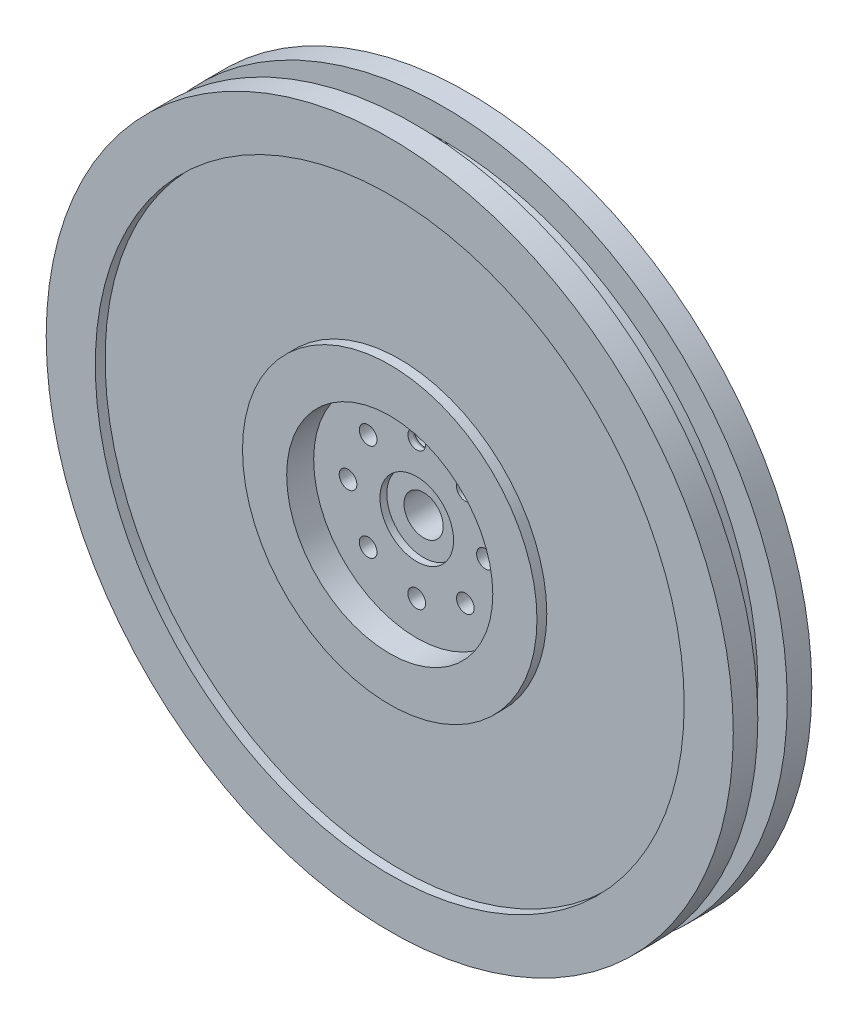
ISO-10303-21;
HEADER;
FILE_DESCRIPTION(('STEP AP214'),'2;1');
FILE_NAME('part.step','',(''),(''),'','','');
FILE_SCHEMA(('AUTOMOTIVE_DESIGN { 1 0 10303 214 1 1 1 1 }'));
ENDSEC;
DATA;
#1=APPLICATION_CONTEXT('core data for automotive mechanical design processes');
#2=APPLICATION_PROTOCOL_DEFINITION('international standard','automotive_design',2000,#1);
#3=PRODUCT_CONTEXT('',#1,'mechanical');
#4=PRODUCT('Part','Part','',(#3));
#5=PRODUCT_RELATED_PRODUCT_CATEGORY('part','',(#4));
#6=PRODUCT_DEFINITION_FORMATION('','',#4);
#7=PRODUCT_DEFINITION_CONTEXT('part definition',#1,'design');
#8=PRODUCT_DEFINITION('design','',#6,#7);
#9=PRODUCT_DEFINITION_SHAPE('','',#8);
#10=(LENGTH_UNIT() NAMED_UNIT(*) SI_UNIT(.MILLI.,.METRE.));
#11=(NAMED_UNIT(*) PLANE_ANGLE_UNIT() SI_UNIT($,.RADIAN.));
#12=(NAMED_UNIT(*) SI_UNIT($,.STERADIAN.) SOLID_ANGLE_UNIT());
#13=UNCERTAINTY_MEASURE_WITH_UNIT(LENGTH_MEASURE(1.E-05),#10,'distance_accuracy_value','');
#14=(GEOMETRIC_REPRESENTATION_CONTEXT(3) GLOBAL_UNCERTAINTY_ASSIGNED_CONTEXT((#13)) GLOBAL_UNIT_ASSIGNED_CONTEXT((#10,
#11,#12)) REPRESENTATION_CONTEXT('',''));
#15=CARTESIAN_POINT('',(0.,0.,0.));
#16=DIRECTION('',(0.,0.,1.));
#17=DIRECTION('',(1.,0.,0.));
#18=AXIS2_PLACEMENT_3D('',#15,#16,#17);
#19=CARTESIAN_POINT('',(0.,0.,0.));
#20=DIRECTION('',(0.,0.,1.));
#21=DIRECTION('',(1.,0.,0.));
#22=AXIS2_PLACEMENT_3D('',#19,#20,#21);
#23=PLANE('',#22);
#24=CARTESIAN_POINT('',(0.,0.,0.));
#25=DIRECTION('',(0.,0.,1.));
#26=DIRECTION('',(1.,0.,0.));
#27=AXIS2_PLACEMENT_3D('',#24,#25,#26);
#28=CIRCLE('',#27,10.5);
#29=CARTESIAN_POINT('',(10.5,0.,0.));
#30=VERTEX_POINT('',#29);
#31=EDGE_CURVE('E211',#30,#30,#28,.T.);
#32=ORIENTED_EDGE('',*,*,#31,.F.);
#33=EDGE_LOOP('',(#32));
#34=FACE_BOUND('',#33,.T.);
#35=CARTESIAN_POINT('',(0.,0.,0.));
#36=DIRECTION('',(0.,0.,1.));
#37=DIRECTION('',(1.,0.,0.));
#38=AXIS2_PLACEMENT_3D('',#35,#36,#37);
#39=CIRCLE('',#38,15.);
#40=CARTESIAN_POINT('',(15.,0.,0.));
#41=VERTEX_POINT('',#40);
#42=EDGE_CURVE('E307',#41,#41,#39,.T.);
#43=ORIENTED_EDGE('',*,*,#42,.T.);
#44=EDGE_LOOP('',(#43));
#45=FACE_BOUND('',#44,.T.);
#46=ADVANCED_FACE('F32',(#34,#45),#23,.T.);
#47=CARTESIAN_POINT('',(0.,7.,-8.));
#48=DIRECTION('',(0.,0.,1.));
#49=DIRECTION('',(1.,0.,0.));
#50=AXIS2_PLACEMENT_3D('',#47,#48,#49);
#51=CYLINDRICAL_SURFACE('',#50,0.9);
#52=CARTESIAN_POINT('',(0.,7.,-5.72360679774999));
#53=DIRECTION('',(0.,0.,1.));
#54=DIRECTION('',(1.,0.,0.));
#55=AXIS2_PLACEMENT_3D('',#52,#53,#54);
#56=CIRCLE('',#55,0.9);
#57=CARTESIAN_POINT('',(0.9,7.,-5.72360679774999));
#58=VERTEX_POINT('',#57);
#59=EDGE_CURVE('E41',#58,#58,#56,.T.);
#60=ORIENTED_EDGE('',*,*,#59,.T.);
#61=EDGE_LOOP('',(#60));
#62=FACE_BOUND('',#61,.T.);
#63=CARTESIAN_POINT('',(0.,7.,-7.));
#64=DIRECTION('',(0.,0.,-1.));
#65=DIRECTION('',(-1.,0.,0.));
#66=AXIS2_PLACEMENT_3D('',#63,#64,#65);
#67=CIRCLE('',#66,0.9);
#68=CARTESIAN_POINT('',(-0.9,7.,-7.));
#69=VERTEX_POINT('',#68);
#70=EDGE_CURVE('E272',#69,#69,#67,.F.);
#71=ORIENTED_EDGE('',*,*,#70,.F.);
#72=EDGE_LOOP('',(#71));
#73=FACE_BOUND('',#72,.T.);
#74=ADVANCED_FACE('F128',(#62,#73),#51,.F.);
#75=CARTESIAN_POINT('',(-4.94974746830575,4.94974746830562,-8.));
#76=DIRECTION('',(0.,0.,1.));
#77=DIRECTION('',(1.,0.,0.));
#78=AXIS2_PLACEMENT_3D('',#75,#76,#77);
#79=CYLINDRICAL_SURFACE('',#78,0.899999999999999);
#80=CARTESIAN_POINT('',(-4.94974746830575,4.94974746830562,-2.75));
#81=DIRECTION('',(0.,0.,1.));
#82=DIRECTION('',(1.,0.,0.));
#83=AXIS2_PLACEMENT_3D('',#80,#81,#82);
#84=CIRCLE('',#83,0.899999999999999);
#85=CARTESIAN_POINT('',(-4.04974746830575,4.94974746830562,-2.75));
#86=VERTEX_POINT('',#85);
#87=EDGE_CURVE('E226',#86,#86,#84,.T.);
#88=ORIENTED_EDGE('',*,*,#87,.T.);
#89=EDGE_LOOP('',(#88));
#90=FACE_BOUND('',#89,.T.);
#91=CARTESIAN_POINT('',(-4.94974746830575,4.94974746830562,-7.));
#92=DIRECTION('',(0.,0.,-1.));
#93=DIRECTION('',(-1.,0.,0.));
#94=AXIS2_PLACEMENT_3D('',#91,#92,#93);
#95=CIRCLE('',#94,0.899999999999999);
#96=CARTESIAN_POINT('',(-5.84974746830575,4.94974746830562,-7.));
#97=VERTEX_POINT('',#96);
#98=EDGE_CURVE('E270',#97,#97,#95,.F.);
#99=ORIENTED_EDGE('',*,*,#98,.F.);
#100=EDGE_LOOP('',(#99));
#101=FACE_BOUND('',#100,.T.);
#102=ADVANCED_FACE('F124',(#90,#101),#79,.F.);
#103=CARTESIAN_POINT('',(-6.9999999999997,-2.98427949019242E-13,-8.));
#104=DIRECTION('',(0.,0.,1.));
#105=DIRECTION('',(1.,0.,0.));
#106=AXIS2_PLACEMENT_3D('',#103,#104,#105);
#107=CYLINDRICAL_SURFACE('',#106,0.899999999999999);
#108=CARTESIAN_POINT('',(-6.9999999999997,-2.98427949019242E-13,-2.75));
#109=DIRECTION('',(0.,0.,1.));
#110=DIRECTION('',(1.,0.,0.));
#111=AXIS2_PLACEMENT_3D('',#108,#109,#110);
#112=CIRCLE('',#111,0.899999999999999);
#113=CARTESIAN_POINT('',(-6.0999999999997,-2.98427949019242E-13,-2.75));
#114=VERTEX_POINT('',#113);
#115=EDGE_CURVE('E229',#114,#114,#112,.T.);
#116=ORIENTED_EDGE('',*,*,#115,.T.);
#117=EDGE_LOOP('',(#116));
#118=FACE_BOUND('',#117,.T.);
#119=CARTESIAN_POINT('',(-6.9999999999997,-2.98427949019242E-13,-7.));
#120=DIRECTION('',(0.,0.,-1.));
#121=DIRECTION('',(-1.,0.,0.));
#122=AXIS2_PLACEMENT_3D('',#119,#120,#121);
#123=CIRCLE('',#122,0.899999999999999);
#124=CARTESIAN_POINT('',(-7.8999999999997,-2.98427949019242E-13,-7.));
#125=VERTEX_POINT('',#124);
#126=EDGE_CURVE('E273',#125,#125,#123,.F.);
#127=ORIENTED_EDGE('',*,*,#126,.F.);
#128=EDGE_LOOP('',(#127));
#129=FACE_BOUND('',#128,.T.);
#130=ADVANCED_FACE('F120',(#118,#129),#107,.F.);
#131=CARTESIAN_POINT('',(-4.94974746830532,-4.94974746830604,-8.));
#132=DIRECTION('',(0.,0.,1.));
#133=DIRECTION('',(1.,0.,0.));
#134=AXIS2_PLACEMENT_3D('',#131,#132,#133);
#135=CYLINDRICAL_SURFACE('',#134,0.899999999999999);
#136=CARTESIAN_POINT('',(-4.94974746830532,-4.94974746830604,-2.75));
#137=DIRECTION('',(0.,0.,1.));
#138=DIRECTION('',(1.,0.,0.));
#139=AXIS2_PLACEMENT_3D('',#136,#137,#138);
#140=CIRCLE('',#139,0.899999999999999);
#141=CARTESIAN_POINT('',(-4.04974746830533,-4.94974746830604,-2.75));
#142=VERTEX_POINT('',#141);
#143=EDGE_CURVE('E232',#142,#142,#140,.T.);
#144=ORIENTED_EDGE('',*,*,#143,.T.);
#145=EDGE_LOOP('',(#144));
#146=FACE_BOUND('',#145,.T.);
#147=CARTESIAN_POINT('',(-4.94974746830532,-4.94974746830604,-7.));
#148=DIRECTION('',(0.,0.,-1.));
#149=DIRECTION('',(-1.,0.,0.));
#150=AXIS2_PLACEMENT_3D('',#147,#148,#149);
#151=CIRCLE('',#150,0.899999999999999);
#152=CARTESIAN_POINT('',(-5.84974746830532,-4.94974746830604,-7.));
#153=VERTEX_POINT('',#152);
#154=EDGE_CURVE('E278',#153,#153,#151,.F.);
#155=ORIENTED_EDGE('',*,*,#154,.F.);
#156=EDGE_LOOP('',(#155));
#157=FACE_BOUND('',#156,.T.);
#158=ADVANCED_FACE('F116',(#146,#157),#135,.F.);
#159=CARTESIAN_POINT('',(5.95141392519678E-13,-7.,-8.));
#160=DIRECTION('',(0.,0.,1.));
#161=DIRECTION('',(1.,0.,0.));
#162=AXIS2_PLACEMENT_3D('',#159,#160,#161);
#163=CYLINDRICAL_SURFACE('',#162,0.9);
#164=CARTESIAN_POINT('',(5.95141392519678E-13,-7.,-2.75));
#165=DIRECTION('',(0.,0.,1.));
#166=DIRECTION('',(1.,0.,0.));
#167=AXIS2_PLACEMENT_3D('',#164,#165,#166);
#168=CIRCLE('',#167,0.9);
#169=CARTESIAN_POINT('',(0.900000000000595,-7.,-2.75));
#170=VERTEX_POINT('',#169);
#171=EDGE_CURVE('E235',#170,#170,#168,.T.);
#172=ORIENTED_EDGE('',*,*,#171,.T.);
#173=EDGE_LOOP('',(#172));
#174=FACE_BOUND('',#173,.T.);
#175=CARTESIAN_POINT('',(5.95141392519678E-13,-7.,-7.));
#176=DIRECTION('',(0.,0.,-1.));
#177=DIRECTION('',(-1.,0.,0.));
#178=AXIS2_PLACEMENT_3D('',#175,#176,#177);
#179=CIRCLE('',#178,0.9);
#180=CARTESIAN_POINT('',(-0.899999999999405,-7.,-7.));
#181=VERTEX_POINT('',#180);
#182=EDGE_CURVE('E284',#181,#181,#179,.F.);
#183=ORIENTED_EDGE('',*,*,#182,.F.);
#184=EDGE_LOOP('',(#183));
#185=FACE_BOUND('',#184,.T.);
#186=ADVANCED_FACE('F112',(#174,#185),#163,.F.);
#187=CARTESIAN_POINT('',(4.94974746830634,-4.94974746830562,-8.));
#188=DIRECTION('',(0.,0.,1.));
#189=DIRECTION('',(1.,0.,0.));
#190=AXIS2_PLACEMENT_3D('',#187,#188,#189);
#191=CYLINDRICAL_SURFACE('',#190,0.899999999999999);
#192=CARTESIAN_POINT('',(4.94974746830634,-4.94974746830562,-2.75));
#193=DIRECTION('',(0.,0.,1.));
#194=DIRECTION('',(1.,0.,0.));
#195=AXIS2_PLACEMENT_3D('',#192,#193,#194);
#196=CIRCLE('',#195,0.899999999999999);
#197=CARTESIAN_POINT('',(5.84974746830634,-4.94974746830562,-2.75));
#198=VERTEX_POINT('',#197);
#199=EDGE_CURVE('E238',#198,#198,#196,.T.);
#200=ORIENTED_EDGE('',*,*,#199,.T.);
#201=EDGE_LOOP('',(#200));
#202=FACE_BOUND('',#201,.T.);
#203=CARTESIAN_POINT('',(4.94974746830634,-4.94974746830562,-7.));
#204=DIRECTION('',(0.,0.,-1.));
#205=DIRECTION('',(-1.,0.,0.));
#206=AXIS2_PLACEMENT_3D('',#203,#204,#205);
#207=CIRCLE('',#206,0.899999999999999);
#208=CARTESIAN_POINT('',(4.04974746830634,-4.94974746830562,-7.));
#209=VERTEX_POINT('',#208);
#210=EDGE_CURVE('E287',#209,#209,#207,.F.);
#211=ORIENTED_EDGE('',*,*,#210,.F.);
#212=EDGE_LOOP('',(#211));
#213=FACE_BOUND('',#212,.T.);
#214=ADVANCED_FACE('F108',(#202,#213),#191,.F.);
#215=CARTESIAN_POINT('',(7.0000000000003,2.97570696259839E-13,-8.));
#216=DIRECTION('',(0.,0.,1.));
#217=DIRECTION('',(1.,0.,0.));
#218=AXIS2_PLACEMENT_3D('',#215,#216,#217);
#219=CYLINDRICAL_SURFACE('',#218,0.9);
#220=CARTESIAN_POINT('',(7.0000000000003,2.97570696259839E-13,-2.75));
#221=DIRECTION('',(0.,0.,1.));
#222=DIRECTION('',(1.,0.,0.));
#223=AXIS2_PLACEMENT_3D('',#220,#221,#222);
#224=CIRCLE('',#223,0.9);
#225=CARTESIAN_POINT('',(7.9000000000003,2.97570696259839E-13,-2.75));
#226=VERTEX_POINT('',#225);
#227=EDGE_CURVE('E241',#226,#226,#224,.T.);
#228=ORIENTED_EDGE('',*,*,#227,.T.);
#229=EDGE_LOOP('',(#228));
#230=FACE_BOUND('',#229,.T.);
#231=CARTESIAN_POINT('',(7.0000000000003,2.97570696259839E-13,-7.));
#232=DIRECTION('',(0.,0.,-1.));
#233=DIRECTION('',(-1.,0.,0.));
#234=AXIS2_PLACEMENT_3D('',#231,#232,#233);
#235=CIRCLE('',#234,0.9);
#236=CARTESIAN_POINT('',(6.1000000000003,2.97570696259839E-13,-7.));
#237=VERTEX_POINT('',#236);
#238=EDGE_CURVE('E290',#237,#237,#235,.F.);
#239=ORIENTED_EDGE('',*,*,#238,.F.);
#240=EDGE_LOOP('',(#239));
#241=FACE_BOUND('',#240,.T.);
#242=ADVANCED_FACE('F104',(#230,#241),#219,.F.);
#243=CARTESIAN_POINT('',(4.94974746830592,4.94974746830604,-8.));
#244=DIRECTION('',(0.,0.,1.));
#245=DIRECTION('',(1.,0.,0.));
#246=AXIS2_PLACEMENT_3D('',#243,#244,#245);
#247=CYLINDRICAL_SURFACE('',#246,0.899999999999999);
#248=CARTESIAN_POINT('',(4.94974746830592,4.94974746830604,-2.75));
#249=DIRECTION('',(0.,0.,1.));
#250=DIRECTION('',(1.,0.,0.));
#251=AXIS2_PLACEMENT_3D('',#248,#249,#250);
#252=CIRCLE('',#251,0.899999999999999);
#253=CARTESIAN_POINT('',(5.84974746830592,4.94974746830604,-2.75));
#254=VERTEX_POINT('',#253);
#255=EDGE_CURVE('E225',#254,#254,#252,.T.);
#256=ORIENTED_EDGE('',*,*,#255,.T.);
#257=EDGE_LOOP('',(#256));
#258=FACE_BOUND('',#257,.T.);
#259=CARTESIAN_POINT('',(4.94974746830592,4.94974746830604,-7.));
#260=DIRECTION('',(0.,0.,-1.));
#261=DIRECTION('',(-1.,0.,0.));
#262=AXIS2_PLACEMENT_3D('',#259,#260,#261);
#263=CIRCLE('',#262,0.899999999999999);
#264=CARTESIAN_POINT('',(4.04974746830592,4.94974746830604,-7.));
#265=VERTEX_POINT('',#264);
#266=EDGE_CURVE('E293',#265,#265,#263,.F.);
#267=ORIENTED_EDGE('',*,*,#266,.F.);
#268=EDGE_LOOP('',(#267));
#269=FACE_BOUND('',#268,.T.);
#270=ADVANCED_FACE('F100',(#258,#269),#247,.F.);
#271=CARTESIAN_POINT('',(0.,0.,-8.));
#272=DIRECTION('',(0.,0.,1.));
#273=DIRECTION('',(1.,0.,0.));
#274=AXIS2_PLACEMENT_3D('',#271,#272,#273);
#275=CYLINDRICAL_SURFACE('',#274,2.);
#276=CARTESIAN_POINT('',(0.,0.,-3.45));
#277=DIRECTION('',(0.,0.,1.));
#278=DIRECTION('',(1.,0.,0.));
#279=AXIS2_PLACEMENT_3D('',#276,#277,#278);
#280=CIRCLE('',#279,2.);
#281=CARTESIAN_POINT('',(2.,0.,-3.45));
#282=VERTEX_POINT('',#281);
#283=EDGE_CURVE('E76',#282,#282,#280,.T.);
#284=ORIENTED_EDGE('',*,*,#283,.T.);
#285=EDGE_LOOP('',(#284));
#286=FACE_BOUND('',#285,.T.);
#287=CARTESIAN_POINT('',(0.,0.,-7.));
#288=DIRECTION('',(0.,0.,-1.));
#289=DIRECTION('',(-1.,0.,0.));
#290=AXIS2_PLACEMENT_3D('',#287,#288,#289);
#291=CIRCLE('',#290,2.);
#292=CARTESIAN_POINT('',(-2.,0.,-7.));
#293=VERTEX_POINT('',#292);
#294=EDGE_CURVE('E36',#293,#293,#291,.F.);
#295=ORIENTED_EDGE('',*,*,#294,.F.);
#296=EDGE_LOOP('',(#295));
#297=FACE_BOUND('',#296,.T.);
#298=ADVANCED_FACE('F96',(#286,#297),#275,.F.);
#299=CARTESIAN_POINT('',(-2.9799932263954E-13,6.99999999999999,-4.50000000000001));
#300=DIRECTION('',(0.,1.,0.));
#301=DIRECTION('',(-1.,0.,0.));
#302=AXIS2_PLACEMENT_3D('',#299,#300,#301);
#303=CYLINDRICAL_SURFACE('',#302,1.);
#304=CARTESIAN_POINT('',(-1.36228261778076E-12,32.,-5.50000000000001));
#305=CARTESIAN_POINT('',(-0.0561557308417592,31.9999997895591,-5.49999751423355));
#306=CARTESIAN_POINT('',(-0.112351830814613,31.999850595653,-5.4952539229644));
#307=CARTESIAN_POINT('',(-0.223195352191761,31.9992697741594,-5.47639718729268));
#308=CARTESIAN_POINT('',(-0.27784084360087,31.9988378094319,-5.4622728581924));
#309=CARTESIAN_POINT('',(-0.383961328263495,31.9977403638238,-5.42505803157308));
#310=CARTESIAN_POINT('',(-0.435437861295043,31.9970749974214,-5.4019719290076));
#311=CARTESIAN_POINT('',(-0.53377043792323,31.9955857948217,-5.34749521062694));
#312=CARTESIAN_POINT('',(-0.580627603843209,31.9947619972612,-5.3161066188477));
#313=CARTESIAN_POINT('',(-0.668428345740677,31.9930482421743,-5.24589825796998));
#314=CARTESIAN_POINT('',(-0.709369492833051,31.9921582577002,-5.20707545179888));
#315=CARTESIAN_POINT('',(-0.784155571589832,31.9904126728757,-5.12310607038457));
#316=CARTESIAN_POINT('',(-0.818000220294046,31.9895570738976,-5.07795924310201));
#317=CARTESIAN_POINT('',(-0.877636661057264,31.9879766044799,-4.98261398242699));
#318=CARTESIAN_POINT('',(-0.903426952188049,31.9872517584167,-4.93241460979541));
#319=CARTESIAN_POINT('',(-0.946212833375826,31.9860147883784,-4.82839592093446));
#320=CARTESIAN_POINT('',(-0.963208460212381,31.9855026635136,-4.7745766198448));
#321=CARTESIAN_POINT('',(-0.987917230819837,31.9847490831907,-4.66486454589672));
#322=CARTESIAN_POINT('',(-0.995633426965868,31.9845075387297,-4.60897246109915));
#323=CARTESIAN_POINT('',(-1.0015737055193,31.9843220869171,-4.49668580862644));
#324=CARTESIAN_POINT('',(-0.999797827588425,31.9843781783218,-4.44029124305185));
#325=CARTESIAN_POINT('',(-0.986806946646317,31.9847815900512,-4.32862117317459));
#326=CARTESIAN_POINT('',(-0.975595243297693,31.9851288085699,-4.27334528459469));
#327=CARTESIAN_POINT('',(-0.944056075150052,31.9860751727529,-4.16546061743889));
#328=CARTESIAN_POINT('',(-0.923728589397806,31.9866743189961,-4.11285184499384));
#329=CARTESIAN_POINT('',(-0.874531094292554,31.9880571154457,-4.01178416778417));
#330=CARTESIAN_POINT('',(-0.845659572948591,31.9888407983035,-3.96332599948788));
#331=CARTESIAN_POINT('',(-0.780194686863323,31.9905042900058,-3.8719431621377));
#332=CARTESIAN_POINT('',(-0.743601302714146,31.991384099092,-3.82901850699199));
#333=CARTESIAN_POINT('',(-0.663712780105182,31.9931411165357,-3.74990194812871));
#334=CARTESIAN_POINT('',(-0.620414780538215,31.9940183236193,-3.7137129333435));
#335=CARTESIAN_POINT('',(-0.528356192755378,31.9956708868503,-3.64911717598409));
#336=CARTESIAN_POINT('',(-0.479595603636486,31.9964462429809,-3.62071043469638));
#337=CARTESIAN_POINT('',(-0.377994368238089,31.9978077134493,-3.57248591240028));
#338=CARTESIAN_POINT('',(-0.3251536785944,31.9983938257755,-3.55266822269298));
#339=CARTESIAN_POINT('',(-0.216892927321001,31.9993107071012,-3.52218620436491));
#340=CARTESIAN_POINT('',(-0.161472873300757,31.999641476854,-3.51152184874241));
#341=CARTESIAN_POINT('',(-0.0496516745875388,32.0000102911557,-3.49965276278333));
#342=CARTESIAN_POINT('',(0.00674904544069194,32.0000484593962,-3.49844403525815));
#343=CARTESIAN_POINT('',(0.118952604377842,31.9998280959164,-3.50551009972968));
#344=CARTESIAN_POINT('',(0.174755444040872,31.9995695645705,-3.51378487976335));
#345=CARTESIAN_POINT('',(0.284168049454613,31.9987850176104,-3.5395797596128));
#346=CARTESIAN_POINT('',(0.337778243600986,31.9982590545189,-3.55709804405947));
#347=CARTESIAN_POINT('',(0.441296908696128,31.9969989097069,-3.60088080864906));
#348=CARTESIAN_POINT('',(0.491205371541923,31.9962647275305,-3.62714530793648));
#349=CARTESIAN_POINT('',(0.585922246352903,31.9946705375315,-3.6876852361573));
#350=CARTESIAN_POINT('',(0.630728938509464,31.9938104875007,-3.72196335466529));
#351=CARTESIAN_POINT('',(0.713953098065489,31.9920616267612,-3.79755354157927));
#352=CARTESIAN_POINT('',(0.752370547963701,31.9911728159736,-3.83886562925192));
#353=CARTESIAN_POINT('',(0.821739041158198,31.9894662790226,-3.92736818471794));
#354=CARTESIAN_POINT('',(0.85268750480999,31.988648577481,-3.9745606749807));
#355=CARTESIAN_POINT('',(0.906221873142248,31.9871768396547,-4.07347409448716));
#356=CARTESIAN_POINT('',(0.928807797506762,31.9865228029847,-4.12519501307132));
#357=CARTESIAN_POINT('',(0.964971437528458,31.9854523127493,-4.2316874167674));
#358=CARTESIAN_POINT('',(0.978550821262222,31.9850358151921,-4.28645833495931));
#359=CARTESIAN_POINT('',(0.996321378818271,31.9844872391367,-4.39750401959555));
#360=CARTESIAN_POINT('',(1.00051256305059,31.9843551603231,-4.45377878437229));
#361=CARTESIAN_POINT('',(0.999387557553666,31.9843903292336,-4.56620891594037));
#362=CARTESIAN_POINT('',(0.994075435589831,31.9845574488897,-4.62236432352074));
#363=CARTESIAN_POINT('',(0.974102977752555,31.9851719059966,-4.73298583230074));
#364=CARTESIAN_POINT('',(0.959442623375152,31.9856192440021,-4.78745193015631));
#365=CARTESIAN_POINT('',(0.921190441802417,31.986743689331,-4.8931502107104));
#366=CARTESIAN_POINT('',(0.897598467892324,31.9874208004287,-4.94438234027018));
#367=CARTESIAN_POINT('',(0.842154056254253,31.9889284323957,-5.04215765117614));
#368=CARTESIAN_POINT('',(0.810301915075621,31.9897589477571,-5.08870100077155));
#369=CARTESIAN_POINT('',(0.739229053206338,31.9914801288361,-5.17579644041168));
#370=CARTESIAN_POINT('',(0.700005967615159,31.9923708137995,-5.21634660011565));
#371=CARTESIAN_POINT('',(0.615297398376931,31.9941119544662,-5.2902977027452));
#372=CARTESIAN_POINT('',(0.569810366969254,31.9949624001568,-5.32369687350331));
#373=CARTESIAN_POINT('',(0.473846472417159,31.9965275059287,-5.38240406280033));
#374=CARTESIAN_POINT('',(0.423366321468704,31.997242075623,-5.40770670298278));
#375=CARTESIAN_POINT('',(0.318911114834655,31.9984532814489,-5.44944816945617));
#376=CARTESIAN_POINT('',(0.264940311314041,31.9989501772099,-5.46589756080014));
#377=CARTESIAN_POINT('',(0.175524040545282,31.9995373085746,-5.48510848353753));
#378=CARTESIAN_POINT('',(0.140658900573788,31.9997100645468,-5.49068577071174));
#379=CARTESIAN_POINT('',(0.0705344834619755,31.9999414763373,-5.49813230908803));
#380=CARTESIAN_POINT('',(0.0352752064479,32.0000001321921,-5.50000156147777));
#381=CARTESIAN_POINT('',(-1.36228261778076E-12,32.,-5.50000000000001));
#382=B_SPLINE_CURVE_WITH_KNOTS('',3,(#304,#305,#306,#307,#308,#309,#310,#311,#312,#313,#314,
#315,#316,#317,#318,#319,#320,#321,#322,#323,#324,#325,#326,#327,#328,#329,#330,#331,#332,#333,
#334,#335,#336,#337,#338,#339,#340,#341,#342,#343,#344,#345,#346,#347,#348,#349,#350,#351,#352,
#353,#354,#355,#356,#357,#358,#359,#360,#361,#362,#363,#364,#365,#366,#367,#368,#369,#370,#371,
#372,#373,#374,#375,#376,#377,#378,#379,#380,#381),.UNSPECIFIED.,.T.,.F.,(4,2,2,2,2,2,2,2,2,2,2,
2,2,2,2,2,2,2,2,2,2,2,2,2,2,2,2,2,2,2,2,2,2,2,2,2,2,2,4),(0.,0.168338433023724,
0.336877937937469,0.505334893407001,0.673750819111982,0.842235694515964,1.01072728667632,
1.17925025850781,1.34777252556524,1.51623934374685,1.68470545800639,1.85311268494542,
2.02152029898157,2.18995773302588,2.35839559042028,2.52690552557325,2.6954154885827,
2.86392724279874,3.0324384999143,3.20087851821983,3.36931832404577,3.53772506160465,
3.70613216778972,3.87459587703683,4.04306004772791,4.21158231970751,4.38010419501071,
4.54859485011953,4.71708531839863,4.88550368380032,5.05392238257163,5.22234384798357,
5.3907592677113,5.55922881453527,5.72774006350257,5.89636301971291,6.06478430047516,
6.17052907115746,6.27627380797042),.UNSPECIFIED.);
#383=CARTESIAN_POINT('',(-1.36228261778076E-12,32.,-5.50000000000001));
#384=VERTEX_POINT('',#383);
#385=EDGE_CURVE('E51',#384,#384,#382,.T.);
#386=ORIENTED_EDGE('',*,*,#385,.T.);
#387=EDGE_LOOP('',(#386));
#388=FACE_BOUND('',#387,.T.);
#389=CARTESIAN_POINT('',(-1.4899966131977E-13,7.,-4.50000000000001));
#390=DIRECTION('',(0.,0.707106781186547,-0.707106781186547));
#391=DIRECTION('',(0.,0.707106781186547,0.707106781186547));
#392=AXIS2_PLACEMENT_3D('',#389,#390,#391);
#393=ELLIPSE('',#392,1.4142135623731,1.);
#394=CARTESIAN_POINT('',(-3.40570654445189E-13,8.,-3.50000000000001));
#395=VERTEX_POINT('',#394);
#396=CARTESIAN_POINT('',(1.,7.00000000000003,-4.50000000000001));
#397=VERTEX_POINT('',#396);
#398=EDGE_CURVE('E74',#395,#397,#393,.T.);
#399=ORIENTED_EDGE('',*,*,#398,.F.);
#400=CARTESIAN_POINT('',(-1.,6.99999999999995,-4.50000000000001));
#401=VERTEX_POINT('',#400);
#402=EDGE_CURVE('E70',#401,#395,#393,.T.);
#403=ORIENTED_EDGE('',*,*,#402,.F.);
#404=CARTESIAN_POINT('',(-1.4899966131977E-13,7.,-4.50000000000001));
#405=DIRECTION('',(0.,0.707106781186547,0.707106781186547));
#406=DIRECTION('',(0.,0.707106781186547,-0.707106781186547));
#407=AXIS2_PLACEMENT_3D('',#404,#405,#406);
#408=ELLIPSE('',#407,1.4142135623731,1.);
#409=CARTESIAN_POINT('',(-3.40570654445189E-13,8.,-5.50000000000001));
#410=VERTEX_POINT('',#409);
#411=EDGE_CURVE('E67',#410,#401,#408,.T.);
#412=ORIENTED_EDGE('',*,*,#411,.F.);
#413=EDGE_CURVE('E78',#397,#410,#408,.T.);
#414=ORIENTED_EDGE('',*,*,#413,.F.);
#415=EDGE_LOOP('',(#399,#403,#412,#414));
#416=FACE_BOUND('',#415,.T.);
#417=ADVANCED_FACE('F90',(#388,#416),#303,.F.);
#418=CARTESIAN_POINT('',(0.,7.,-3.27639320225003));
#419=DIRECTION('',(0.,0.,-1.));
#420=DIRECTION('',(-1.,0.,0.));
#421=AXIS2_PLACEMENT_3D('',#418,#419,#420);
#422=CIRCLE('',#421,0.9);
#423=CARTESIAN_POINT('',(-0.9,7.,-3.27639320225003));
#424=VERTEX_POINT('',#423);
#425=EDGE_CURVE('E11',#424,#424,#422,.T.);
#426=ORIENTED_EDGE('',*,*,#425,.T.);
#427=EDGE_LOOP('',(#426));
#428=FACE_BOUND('',#427,.T.);
#429=CARTESIAN_POINT('',(0.,7.,-2.75));
#430=DIRECTION('',(0.,0.,1.));
#431=DIRECTION('',(1.,0.,0.));
#432=AXIS2_PLACEMENT_3D('',#429,#430,#431);
#433=CIRCLE('',#432,0.9);
#434=CARTESIAN_POINT('',(0.9,7.,-2.75));
#435=VERTEX_POINT('',#434);
#436=EDGE_CURVE('E220',#435,#435,#433,.T.);
#437=ORIENTED_EDGE('',*,*,#436,.T.);
#438=EDGE_LOOP('',(#437));
#439=FACE_BOUND('',#438,.T.);
#440=ADVANCED_FACE('F95',(#428,#439),#51,.F.);
#441=CARTESIAN_POINT('',(0.,0.,0.));
#442=DIRECTION('',(0.,0.,1.));
#443=DIRECTION('',(1.,0.,0.));
#444=AXIS2_PLACEMENT_3D('',#441,#442,#443);
#445=CIRCLE('',#444,30.);
#446=CARTESIAN_POINT('',(30.,0.,0.));
#447=VERTEX_POINT('',#446);
#448=EDGE_CURVE('E187',#447,#447,#445,.T.);
#449=ORIENTED_EDGE('',*,*,#448,.F.);
#450=EDGE_LOOP('',(#449));
#451=FACE_BOUND('',#450,.T.);
#452=CARTESIAN_POINT('',(0.,0.,0.));
#453=DIRECTION('',(0.,0.,1.));
#454=DIRECTION('',(1.,0.,0.));
#455=AXIS2_PLACEMENT_3D('',#452,#453,#454);
#456=CIRCLE('',#455,35.);
#457=CARTESIAN_POINT('',(35.,0.,0.));
#458=VERTEX_POINT('',#457);
#459=EDGE_CURVE('E190',#458,#458,#456,.T.);
#460=ORIENTED_EDGE('',*,*,#459,.T.);
#461=EDGE_LOOP('',(#460));
#462=FACE_BOUND('',#461,.T.);
#463=ADVANCED_FACE('F132',(#451,#462),#23,.T.);
#464=CARTESIAN_POINT('',(0.,0.,27.7721110053205));
#465=DIRECTION('',(0.,0.,1.));
#466=DIRECTION('',(1.,0.,0.));
#467=AXIS2_PLACEMENT_3D('',#464,#465,#466);
#468=CYLINDRICAL_SURFACE('',#467,35.);
#469=CARTESIAN_POINT('',(0.,0.,-2.50000000000001));
#470=DIRECTION('',(0.,0.,1.));
#471=DIRECTION('',(1.,0.,0.));
#472=AXIS2_PLACEMENT_3D('',#469,#470,#471);
#473=CIRCLE('',#472,35.);
#474=CARTESIAN_POINT('',(35.,0.,-2.50000000000001));
#475=VERTEX_POINT('',#474);
#476=EDGE_CURVE('E192',#475,#475,#473,.T.);
#477=ORIENTED_EDGE('',*,*,#476,.T.);
#478=EDGE_LOOP('',(#477));
#479=FACE_BOUND('',#478,.T.);
#480=ORIENTED_EDGE('',*,*,#459,.F.);
#481=EDGE_LOOP('',(#480));
#482=FACE_BOUND('',#481,.T.);
#483=ADVANCED_FACE('F178',(#479,#482),#468,.T.);
#484=CARTESIAN_POINT('',(35.,0.,-2.50000000000001));
#485=DIRECTION('',(0.,0.,-1.));
#486=DIRECTION('',(-1.,0.,0.));
#487=AXIS2_PLACEMENT_3D('',#484,#485,#486);
#488=PLANE('',#487);
#489=CARTESIAN_POINT('',(0.,0.,-2.50000000000001));
#490=DIRECTION('',(0.,0.,1.));
#491=DIRECTION('',(1.,0.,0.));
#492=AXIS2_PLACEMENT_3D('',#489,#490,#491);
#493=CIRCLE('',#492,32.);
#494=CARTESIAN_POINT('',(32.,0.,-2.50000000000001));
#495=VERTEX_POINT('',#494);
#496=EDGE_CURVE('E197',#495,#495,#493,.T.);
#497=ORIENTED_EDGE('',*,*,#496,.T.);
#498=EDGE_LOOP('',(#497));
#499=FACE_BOUND('',#498,.T.);
#500=ORIENTED_EDGE('',*,*,#476,.F.);
#501=EDGE_LOOP('',(#500));
#502=FACE_BOUND('',#501,.T.);
#503=ADVANCED_FACE('F163',(#499,#502),#488,.T.);
#504=CARTESIAN_POINT('',(0.,0.,27.7721110053205));
#505=DIRECTION('',(0.,0.,1.));
#506=DIRECTION('',(1.,0.,0.));
#507=AXIS2_PLACEMENT_3D('',#504,#505,#506);
#508=CYLINDRICAL_SURFACE('',#507,32.);
#509=ORIENTED_EDGE('',*,*,#385,.F.);
#510=CARTESIAN_POINT('',(0.,0.,-5.50000000000001));
#511=DIRECTION('',(0.,0.,1.));
#512=DIRECTION('',(1.,0.,0.));
#513=AXIS2_PLACEMENT_3D('',#510,#511,#512);
#514=CIRCLE('',#513,32.);
#515=EDGE_CURVE('E202',#384,#384,#514,.T.);
#516=ORIENTED_EDGE('',*,*,#515,.T.);
#517=EDGE_LOOP('',(#509,#516));
#518=FACE_BOUND('',#517,.T.);
#519=ORIENTED_EDGE('',*,*,#496,.F.);
#520=EDGE_LOOP('',(#519));
#521=FACE_BOUND('',#520,.T.);
#522=ADVANCED_FACE('F86',(#518,#521),#508,.T.);
#523=CARTESIAN_POINT('',(32.,0.,-5.50000000000001));
#524=DIRECTION('',(0.,0.,1.));
#525=DIRECTION('',(1.,0.,0.));
#526=AXIS2_PLACEMENT_3D('',#523,#524,#525);
#527=PLANE('',#526);
#528=CARTESIAN_POINT('',(0.,0.,-5.50000000000001));
#529=DIRECTION('',(0.,0.,1.));
#530=DIRECTION('',(1.,0.,0.));
#531=AXIS2_PLACEMENT_3D('',#528,#529,#530);
#532=CIRCLE('',#531,35.);
#533=CARTESIAN_POINT('',(35.,0.,-5.50000000000001));
#534=VERTEX_POINT('',#533);
#535=EDGE_CURVE('E205',#534,#534,#532,.T.);
#536=ORIENTED_EDGE('',*,*,#535,.T.);
#537=EDGE_LOOP('',(#536));
#538=FACE_BOUND('',#537,.T.);
#539=ORIENTED_EDGE('',*,*,#515,.F.);
#540=EDGE_LOOP('',(#539));
#541=FACE_BOUND('',#540,.T.);
#542=ADVANCED_FACE('F156',(#538,#541),#527,.T.);
#543=CARTESIAN_POINT('',(0.,0.,27.7721110053205));
#544=DIRECTION('',(0.,0.,1.));
#545=DIRECTION('',(1.,0.,0.));
#546=AXIS2_PLACEMENT_3D('',#543,#544,#545);
#547=CYLINDRICAL_SURFACE('',#546,35.);
#548=CARTESIAN_POINT('',(0.,0.,-8.));
#549=DIRECTION('',(0.,0.,1.));
#550=DIRECTION('',(1.,0.,0.));
#551=AXIS2_PLACEMENT_3D('',#548,#549,#550);
#552=CIRCLE('',#551,35.);
#553=CARTESIAN_POINT('',(35.,0.,-8.));
#554=VERTEX_POINT('',#553);
#555=EDGE_CURVE('E207',#554,#554,#552,.T.);
#556=ORIENTED_EDGE('',*,*,#555,.T.);
#557=EDGE_LOOP('',(#556));
#558=FACE_BOUND('',#557,.T.);
#559=ORIENTED_EDGE('',*,*,#535,.F.);
#560=EDGE_LOOP('',(#559));
#561=FACE_BOUND('',#560,.T.);
#562=ADVANCED_FACE('F153',(#558,#561),#547,.T.);
#563=CARTESIAN_POINT('',(35.,0.,-8.));
#564=DIRECTION('',(0.,0.,-1.));
#565=DIRECTION('',(-1.,0.,0.));
#566=AXIS2_PLACEMENT_3D('',#563,#564,#565);
#567=PLANE('',#566);
#568=CARTESIAN_POINT('',(0.,0.,-8.));
#569=DIRECTION('',(0.,0.,-1.));
#570=DIRECTION('',(-1.,0.,0.));
#571=AXIS2_PLACEMENT_3D('',#568,#569,#570);
#572=CIRCLE('',#571,30.);
#573=CARTESIAN_POINT('',(-30.,0.,-8.));
#574=VERTEX_POINT('',#573);
#575=EDGE_CURVE('E296',#574,#574,#572,.T.);
#576=ORIENTED_EDGE('',*,*,#575,.F.);
#577=EDGE_LOOP('',(#576));
#578=FACE_BOUND('',#577,.T.);
#579=ORIENTED_EDGE('',*,*,#555,.F.);
#580=EDGE_LOOP('',(#579));
#581=FACE_BOUND('',#580,.T.);
#582=ADVANCED_FACE('F149',(#578,#581),#567,.T.);
#583=CARTESIAN_POINT('',(0.,0.,-2.75));
#584=DIRECTION('',(0.,0.,1.));
#585=DIRECTION('',(1.,0.,0.));
#586=AXIS2_PLACEMENT_3D('',#583,#584,#585);
#587=CYLINDRICAL_SURFACE('',#586,10.5);
#588=CARTESIAN_POINT('',(0.,0.,-2.75));
#589=DIRECTION('',(0.,0.,1.));
#590=DIRECTION('',(1.,0.,0.));
#591=AXIS2_PLACEMENT_3D('',#588,#589,#590);
#592=CIRCLE('',#591,10.5);
#593=CARTESIAN_POINT('',(10.5,0.,-2.75));
#594=VERTEX_POINT('',#593);
#595=EDGE_CURVE('E210',#594,#594,#592,.T.);
#596=ORIENTED_EDGE('',*,*,#595,.F.);
#597=EDGE_LOOP('',(#596));
#598=FACE_BOUND('',#597,.T.);
#599=ORIENTED_EDGE('',*,*,#31,.T.);
#600=EDGE_LOOP('',(#599));
#601=FACE_BOUND('',#600,.T.);
#602=ADVANCED_FACE('F145',(#598,#601),#587,.F.);
#603=CARTESIAN_POINT('',(0.,0.,-2.75));
#604=DIRECTION('',(0.,0.,1.));
#605=DIRECTION('',(1.,0.,0.));
#606=AXIS2_PLACEMENT_3D('',#603,#604,#605);
#607=PLANE('',#606);
#608=ORIENTED_EDGE('',*,*,#255,.F.);
#609=EDGE_LOOP('',(#608));
#610=FACE_BOUND('',#609,.T.);
#611=ORIENTED_EDGE('',*,*,#227,.F.);
#612=EDGE_LOOP('',(#611));
#613=FACE_BOUND('',#612,.T.);
#614=ORIENTED_EDGE('',*,*,#199,.F.);
#615=EDGE_LOOP('',(#614));
#616=FACE_BOUND('',#615,.T.);
#617=ORIENTED_EDGE('',*,*,#171,.F.);
#618=EDGE_LOOP('',(#617));
#619=FACE_BOUND('',#618,.T.);
#620=ORIENTED_EDGE('',*,*,#143,.F.);
#621=EDGE_LOOP('',(#620));
#622=FACE_BOUND('',#621,.T.);
#623=ORIENTED_EDGE('',*,*,#115,.F.);
#624=EDGE_LOOP('',(#623));
#625=FACE_BOUND('',#624,.T.);
#626=ORIENTED_EDGE('',*,*,#87,.F.);
#627=EDGE_LOOP('',(#626));
#628=FACE_BOUND('',#627,.T.);
#629=ORIENTED_EDGE('',*,*,#436,.F.);
#630=EDGE_LOOP('',(#629));
#631=FACE_BOUND('',#630,.T.);
#632=CARTESIAN_POINT('',(0.,0.,-2.75));
#633=DIRECTION('',(0.,0.,1.));
#634=DIRECTION('',(1.,0.,0.));
#635=AXIS2_PLACEMENT_3D('',#632,#633,#634);
#636=CIRCLE('',#635,3.75);
#637=CARTESIAN_POINT('',(3.75,0.,-2.75));
#638=VERTEX_POINT('',#637);
#639=EDGE_CURVE('E217',#638,#638,#636,.T.);
#640=ORIENTED_EDGE('',*,*,#639,.F.);
#641=EDGE_LOOP('',(#640));
#642=FACE_BOUND('',#641,.T.);
#643=ORIENTED_EDGE('',*,*,#595,.T.);
#644=EDGE_LOOP('',(#643));
#645=FACE_BOUND('',#644,.T.);
#646=ADVANCED_FACE('F141',(#610,#613,#616,#619,#622,#625,#628,#631,#642,#645),#607,.T.);
#647=CARTESIAN_POINT('',(0.,0.,-3.45));
#648=DIRECTION('',(0.,0.,1.));
#649=DIRECTION('',(1.,0.,0.));
#650=AXIS2_PLACEMENT_3D('',#647,#648,#649);
#651=CYLINDRICAL_SURFACE('',#650,3.75);
#652=CARTESIAN_POINT('',(0.,0.,-3.45));
#653=DIRECTION('',(0.,0.,1.));
#654=DIRECTION('',(1.,0.,0.));
#655=AXIS2_PLACEMENT_3D('',#652,#653,#654);
#656=CIRCLE('',#655,3.75);
#657=CARTESIAN_POINT('',(3.75,0.,-3.45));
#658=VERTEX_POINT('',#657);
#659=EDGE_CURVE('E214',#658,#658,#656,.T.);
#660=ORIENTED_EDGE('',*,*,#659,.F.);
#661=EDGE_LOOP('',(#660));
#662=FACE_BOUND('',#661,.T.);
#663=ORIENTED_EDGE('',*,*,#639,.T.);
#664=EDGE_LOOP('',(#663));
#665=FACE_BOUND('',#664,.T.);
#666=ADVANCED_FACE('F137',(#662,#665),#651,.F.);
#667=CARTESIAN_POINT('',(0.,0.,-3.45));
#668=DIRECTION('',(0.,0.,1.));
#669=DIRECTION('',(1.,0.,0.));
#670=AXIS2_PLACEMENT_3D('',#667,#668,#669);
#671=PLANE('',#670);
#672=ORIENTED_EDGE('',*,*,#283,.F.);
#673=EDGE_LOOP('',(#672));
#674=FACE_BOUND('',#673,.T.);
#675=ORIENTED_EDGE('',*,*,#659,.T.);
#676=EDGE_LOOP('',(#675));
#677=FACE_BOUND('',#676,.T.);
#678=ADVANCED_FACE('F134',(#674,#677),#671,.T.);
#679=CARTESIAN_POINT('',(0.,7.,-3.50000000000001));
#680=DIRECTION('',(0.,0.,-1.));
#681=DIRECTION('',(-1.,0.,0.));
#682=AXIS2_PLACEMENT_3D('',#679,#680,#681);
#683=CYLINDRICAL_SURFACE('',#682,1.);
#684=ORIENTED_EDGE('',*,*,#402,.T.);
#685=CARTESIAN_POINT('',(0.,7.,-3.50000000000001));
#686=DIRECTION('',(0.,0.,1.));
#687=DIRECTION('',(1.,0.,0.));
#688=AXIS2_PLACEMENT_3D('',#685,#686,#687);
#689=CIRCLE('',#688,1.);
#690=EDGE_CURVE('E62',#395,#395,#689,.T.);
#691=ORIENTED_EDGE('',*,*,#690,.T.);
#692=ORIENTED_EDGE('',*,*,#398,.T.);
#693=ORIENTED_EDGE('',*,*,#413,.T.);
#694=CARTESIAN_POINT('',(0.,7.,-5.50000000000001));
#695=DIRECTION('',(0.,0.,1.));
#696=DIRECTION('',(1.,0.,0.));
#697=AXIS2_PLACEMENT_3D('',#694,#695,#696);
#698=CIRCLE('',#697,1.);
#699=EDGE_CURVE('E46',#410,#410,#698,.T.);
#700=ORIENTED_EDGE('',*,*,#699,.F.);
#701=ORIENTED_EDGE('',*,*,#411,.T.);
#702=EDGE_LOOP('',(#684,#691,#692,#693,#700,#701));
#703=FACE_BOUND('',#702,.T.);
#704=ADVANCED_FACE('F71',(#703),#683,.F.);
#705=CARTESIAN_POINT('',(0.,7.,-5.72360679774999));
#706=DIRECTION('',(0.,0.,1.));
#707=DIRECTION('',(1.,0.,0.));
#708=AXIS2_PLACEMENT_3D('',#705,#706,#707);
#709=TOROIDAL_SURFACE('',#708,1.2,0.3);
#710=ORIENTED_EDGE('',*,*,#59,.F.);
#711=EDGE_LOOP('',(#710));
#712=FACE_BOUND('',#711,.T.);
#713=ORIENTED_EDGE('',*,*,#699,.T.);
#714=EDGE_LOOP('',(#713));
#715=FACE_BOUND('',#714,.T.);
#716=ADVANCED_FACE('F339',(#712,#715),#709,.T.);
#717=CARTESIAN_POINT('',(0.,7.,-3.27639320225003));
#718=DIRECTION('',(0.,0.,-1.));
#719=DIRECTION('',(-1.,0.,0.));
#720=AXIS2_PLACEMENT_3D('',#717,#718,#719);
#721=TOROIDAL_SURFACE('',#720,1.2,0.3);
#722=ORIENTED_EDGE('',*,*,#690,.F.);
#723=EDGE_LOOP('',(#722));
#724=FACE_BOUND('',#723,.T.);
#725=ORIENTED_EDGE('',*,*,#425,.F.);
#726=EDGE_LOOP('',(#725));
#727=FACE_BOUND('',#726,.T.);
#728=ADVANCED_FACE('F34',(#724,#727),#721,.T.);
#729=CARTESIAN_POINT('',(0.,0.,-7.));
#730=DIRECTION('',(0.,0.,-1.));
#731=DIRECTION('',(-1.,0.,0.));
#732=AXIS2_PLACEMENT_3D('',#729,#730,#731);
#733=PLANE('',#732);
#734=CARTESIAN_POINT('',(0.,0.,-7.));
#735=DIRECTION('',(0.,0.,-1.));
#736=DIRECTION('',(-1.,0.,0.));
#737=AXIS2_PLACEMENT_3D('',#734,#735,#736);
#738=CIRCLE('',#737,30.);
#739=CARTESIAN_POINT('',(-30.,0.,-7.));
#740=VERTEX_POINT('',#739);
#741=EDGE_CURVE('E299',#740,#740,#738,.T.);
#742=ORIENTED_EDGE('',*,*,#741,.T.);
#743=EDGE_LOOP('',(#742));
#744=FACE_BOUND('',#743,.T.);
#745=ORIENTED_EDGE('',*,*,#294,.T.);
#746=EDGE_LOOP('',(#745));
#747=FACE_BOUND('',#746,.T.);
#748=ORIENTED_EDGE('',*,*,#266,.T.);
#749=EDGE_LOOP('',(#748));
#750=FACE_BOUND('',#749,.T.);
#751=ORIENTED_EDGE('',*,*,#238,.T.);
#752=EDGE_LOOP('',(#751));
#753=FACE_BOUND('',#752,.T.);
#754=ORIENTED_EDGE('',*,*,#210,.T.);
#755=EDGE_LOOP('',(#754));
#756=FACE_BOUND('',#755,.T.);
#757=ORIENTED_EDGE('',*,*,#182,.T.);
#758=EDGE_LOOP('',(#757));
#759=FACE_BOUND('',#758,.T.);
#760=ORIENTED_EDGE('',*,*,#154,.T.);
#761=EDGE_LOOP('',(#760));
#762=FACE_BOUND('',#761,.T.);
#763=ORIENTED_EDGE('',*,*,#126,.T.);
#764=EDGE_LOOP('',(#763));
#765=FACE_BOUND('',#764,.T.);
#766=ORIENTED_EDGE('',*,*,#98,.T.);
#767=EDGE_LOOP('',(#766));
#768=FACE_BOUND('',#767,.T.);
#769=ORIENTED_EDGE('',*,*,#70,.T.);
#770=EDGE_LOOP('',(#769));
#771=FACE_BOUND('',#770,.T.);
#772=ADVANCED_FACE('F330',(#744,#747,#750,#753,#756,#759,#762,#765,#768,#771),#733,.T.);
#773=CARTESIAN_POINT('',(0.,0.,-7.));
#774=DIRECTION('',(0.,0.,-1.));
#775=DIRECTION('',(-1.,0.,0.));
#776=AXIS2_PLACEMENT_3D('',#773,#774,#775);
#777=CYLINDRICAL_SURFACE('',#776,30.);
#778=ORIENTED_EDGE('',*,*,#741,.F.);
#779=EDGE_LOOP('',(#778));
#780=FACE_BOUND('',#779,.T.);
#781=ORIENTED_EDGE('',*,*,#575,.T.);
#782=EDGE_LOOP('',(#781));
#783=FACE_BOUND('',#782,.T.);
#784=ADVANCED_FACE('F325',(#780,#783),#777,.F.);
#785=CARTESIAN_POINT('',(0.,0.,-1.));
#786=DIRECTION('',(0.,0.,1.));
#787=DIRECTION('',(1.,0.,0.));
#788=AXIS2_PLACEMENT_3D('',#785,#786,#787);
#789=CYLINDRICAL_SURFACE('',#788,30.);
#790=CARTESIAN_POINT('',(0.,0.,-1.));
#791=DIRECTION('',(0.,0.,1.));
#792=DIRECTION('',(1.,0.,0.));
#793=AXIS2_PLACEMENT_3D('',#790,#791,#792);
#794=CIRCLE('',#793,30.);
#795=CARTESIAN_POINT('',(30.,0.,-1.));
#796=VERTEX_POINT('',#795);
#797=EDGE_CURVE('E300',#796,#796,#794,.T.);
#798=ORIENTED_EDGE('',*,*,#797,.F.);
#799=EDGE_LOOP('',(#798));
#800=FACE_BOUND('',#799,.T.);
#801=ORIENTED_EDGE('',*,*,#448,.T.);
#802=EDGE_LOOP('',(#801));
#803=FACE_BOUND('',#802,.T.);
#804=ADVANCED_FACE('F319',(#800,#803),#789,.F.);
#805=CARTESIAN_POINT('',(0.,0.,-1.));
#806=DIRECTION('',(0.,0.,1.));
#807=DIRECTION('',(1.,0.,0.));
#808=AXIS2_PLACEMENT_3D('',#805,#806,#807);
#809=PLANE('',#808);
#810=CARTESIAN_POINT('',(0.,0.,-1.));
#811=DIRECTION('',(0.,0.,1.));
#812=DIRECTION('',(1.,0.,0.));
#813=AXIS2_PLACEMENT_3D('',#810,#811,#812);
#814=CIRCLE('',#813,15.);
#815=CARTESIAN_POINT('',(15.,0.,-1.));
#816=VERTEX_POINT('',#815);
#817=EDGE_CURVE('E304',#816,#816,#814,.T.);
#818=ORIENTED_EDGE('',*,*,#817,.F.);
#819=EDGE_LOOP('',(#818));
#820=FACE_BOUND('',#819,.T.);
#821=ORIENTED_EDGE('',*,*,#797,.T.);
#822=EDGE_LOOP('',(#821));
#823=FACE_BOUND('',#822,.T.);
#824=ADVANCED_FACE('F316',(#820,#823),#809,.T.);
#825=CARTESIAN_POINT('',(0.,0.,-1.));
#826=DIRECTION('',(0.,0.,1.));
#827=DIRECTION('',(1.,0.,0.));
#828=AXIS2_PLACEMENT_3D('',#825,#826,#827);
#829=CYLINDRICAL_SURFACE('',#828,15.);
#830=ORIENTED_EDGE('',*,*,#817,.T.);
#831=EDGE_LOOP('',(#830));
#832=FACE_BOUND('',#831,.T.);
#833=ORIENTED_EDGE('',*,*,#42,.F.);
#834=EDGE_LOOP('',(#833));
#835=FACE_BOUND('',#834,.T.);
#836=ADVANCED_FACE('F313',(#832,#835),#829,.T.);
#837=CLOSED_SHELL('',(#46,#74,#102,#130,#158,#186,#214,#242,#270,#298,#417,#440,#463,#483,#503,
#522,#542,#562,#582,#602,#646,#666,#678,#704,#716,#728,#772,#784,#804,#824,#836));
#838=MANIFOLD_SOLID_BREP('B2',#837);
#839=ADVANCED_BREP_SHAPE_REPRESENTATION('',(#18,#838),#14);
#840=SHAPE_DEFINITION_REPRESENTATION(#9,#839);
ENDSEC;
END-ISO-10303-21;
